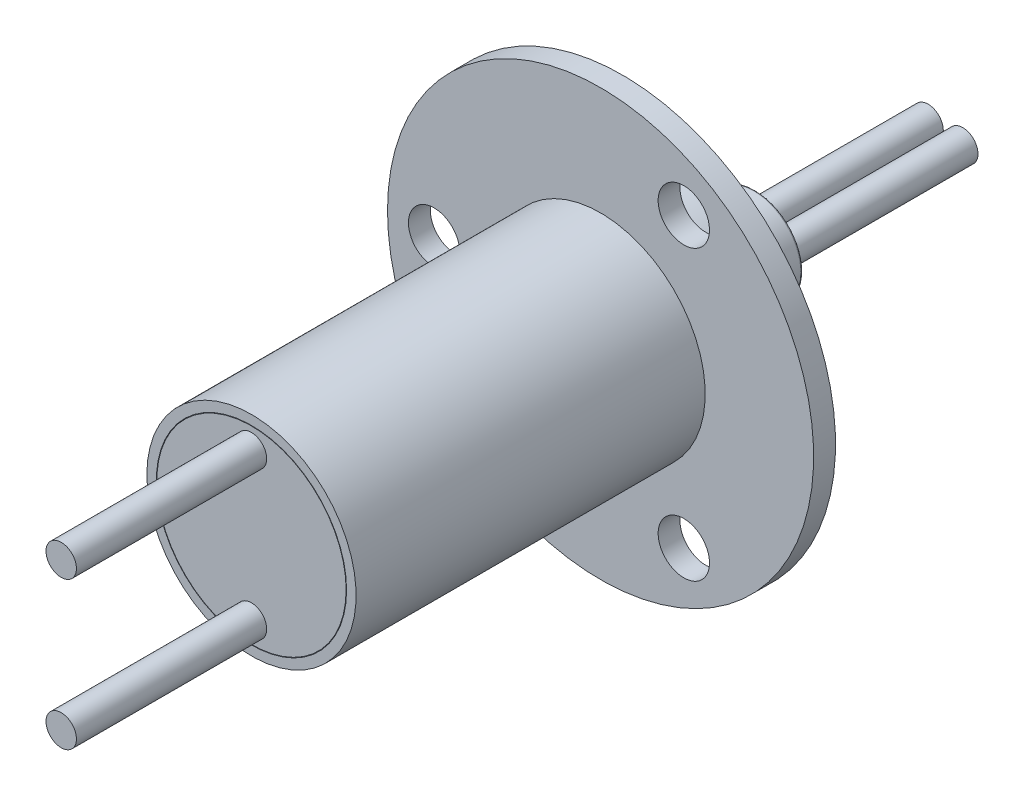
ISO-10303-21;
HEADER;
FILE_DESCRIPTION(('STEP AP214'),'2;1');
FILE_NAME('part.step','',(''),(''),'','','');
FILE_SCHEMA(('AUTOMOTIVE_DESIGN { 1 0 10303 214 1 1 1 1 }'));
ENDSEC;
DATA;
#1=APPLICATION_CONTEXT('core data for automotive mechanical design processes');
#2=APPLICATION_PROTOCOL_DEFINITION('international standard','automotive_design',2000,#1);
#3=PRODUCT_CONTEXT('',#1,'mechanical');
#4=PRODUCT('Part','Part','',(#3));
#5=PRODUCT_RELATED_PRODUCT_CATEGORY('part','',(#4));
#6=PRODUCT_DEFINITION_FORMATION('','',#4);
#7=PRODUCT_DEFINITION_CONTEXT('part definition',#1,'design');
#8=PRODUCT_DEFINITION('design','',#6,#7);
#9=PRODUCT_DEFINITION_SHAPE('','',#8);
#10=(LENGTH_UNIT() NAMED_UNIT(*) SI_UNIT(.MILLI.,.METRE.));
#11=(NAMED_UNIT(*) PLANE_ANGLE_UNIT() SI_UNIT($,.RADIAN.));
#12=(NAMED_UNIT(*) SI_UNIT($,.STERADIAN.) SOLID_ANGLE_UNIT());
#13=UNCERTAINTY_MEASURE_WITH_UNIT(LENGTH_MEASURE(1.E-05),#10,'distance_accuracy_value','');
#14=(GEOMETRIC_REPRESENTATION_CONTEXT(3) GLOBAL_UNCERTAINTY_ASSIGNED_CONTEXT((#13)) GLOBAL_UNIT_ASSIGNED_CONTEXT((#10,
#11,#12)) REPRESENTATION_CONTEXT('',''));
#15=CARTESIAN_POINT('',(0.,0.,0.));
#16=DIRECTION('',(0.,0.,1.));
#17=DIRECTION('',(1.,0.,0.));
#18=AXIS2_PLACEMENT_3D('',#15,#16,#17);
#19=CARTESIAN_POINT('',(-1.77252855070767,0.311486061157739,-19.9));
#20=DIRECTION('',(0.,0.,-1.));
#21=DIRECTION('',(-1.,0.,0.));
#22=AXIS2_PLACEMENT_3D('',#19,#20,#21);
#23=PLANE('',#22);
#24=CARTESIAN_POINT('',(-1.77252855070767,0.311486061157739,-19.9));
#25=DIRECTION('',(0.,0.,1.));
#26=DIRECTION('',(1.,0.,0.));
#27=AXIS2_PLACEMENT_3D('',#24,#25,#26);
#28=CIRCLE('',#27,1.6);
#29=CARTESIAN_POINT('',(-0.172528550707669,0.311486061157739,-19.9));
#30=VERTEX_POINT('',#29);
#31=EDGE_CURVE('E19',#30,#30,#28,.T.);
#32=ORIENTED_EDGE('',*,*,#31,.F.);
#33=EDGE_LOOP('',(#32));
#34=FACE_BOUND('',#33,.T.);
#35=ADVANCED_FACE('F15',(#34),#23,.T.);
#36=CARTESIAN_POINT('',(1.87664787206682,0.,-19.9));
#37=DIRECTION('',(0.,0.,-1.));
#38=DIRECTION('',(-1.,0.,0.));
#39=AXIS2_PLACEMENT_3D('',#36,#37,#38);
#40=PLANE('',#39);
#41=CARTESIAN_POINT('',(1.87664787206682,0.,-19.9));
#42=DIRECTION('',(0.,0.,1.));
#43=DIRECTION('',(1.,0.,0.));
#44=AXIS2_PLACEMENT_3D('',#41,#42,#43);
#45=CIRCLE('',#44,1.6);
#46=CARTESIAN_POINT('',(3.47664787206682,0.,-19.9));
#47=VERTEX_POINT('',#46);
#48=EDGE_CURVE('E109',#47,#47,#45,.T.);
#49=ORIENTED_EDGE('',*,*,#48,.F.);
#50=EDGE_LOOP('',(#49));
#51=FACE_BOUND('',#50,.T.);
#52=ADVANCED_FACE('F120',(#51),#40,.T.);
#53=CARTESIAN_POINT('',(-1.77252855070767,0.311486061157739,-19.9));
#54=DIRECTION('',(0.,0.,1.));
#55=DIRECTION('',(1.,0.,0.));
#56=AXIS2_PLACEMENT_3D('',#53,#54,#55);
#57=CYLINDRICAL_SURFACE('',#56,1.6);
#58=ORIENTED_EDGE('',*,*,#31,.T.);
#59=EDGE_LOOP('',(#58));
#60=FACE_BOUND('',#59,.T.);
#61=CARTESIAN_POINT('',(-1.77252855070767,0.311486061157739,0.0999999999999994));
#62=DIRECTION('',(0.,0.,1.));
#63=DIRECTION('',(1.,0.,0.));
#64=AXIS2_PLACEMENT_3D('',#61,#62,#63);
#65=CIRCLE('',#64,1.6);
#66=CARTESIAN_POINT('',(-0.172528550707669,0.311486061157739,0.0999999999999994));
#67=VERTEX_POINT('',#66);
#68=EDGE_CURVE('E107',#67,#67,#65,.T.);
#69=ORIENTED_EDGE('',*,*,#68,.F.);
#70=EDGE_LOOP('',(#69));
#71=FACE_BOUND('',#70,.T.);
#72=ADVANCED_FACE('F116',(#60,#71),#57,.T.);
#73=CARTESIAN_POINT('',(1.87664787206682,0.,-19.9));
#74=DIRECTION('',(0.,0.,1.));
#75=DIRECTION('',(1.,0.,0.));
#76=AXIS2_PLACEMENT_3D('',#73,#74,#75);
#77=CYLINDRICAL_SURFACE('',#76,1.6);
#78=ORIENTED_EDGE('',*,*,#48,.T.);
#79=EDGE_LOOP('',(#78));
#80=FACE_BOUND('',#79,.T.);
#81=CARTESIAN_POINT('',(1.87664787206682,0.,0.0999999999999994));
#82=DIRECTION('',(0.,0.,1.));
#83=DIRECTION('',(1.,0.,0.));
#84=AXIS2_PLACEMENT_3D('',#81,#82,#83);
#85=CIRCLE('',#84,1.6);
#86=CARTESIAN_POINT('',(3.47664787206682,0.,0.0999999999999994));
#87=VERTEX_POINT('',#86);
#88=EDGE_CURVE('E104',#87,#87,#85,.T.);
#89=ORIENTED_EDGE('',*,*,#88,.F.);
#90=EDGE_LOOP('',(#89));
#91=FACE_BOUND('',#90,.T.);
#92=ADVANCED_FACE('F225',(#80,#91),#77,.T.);
#93=CARTESIAN_POINT('',(0.,0.,0.1));
#94=DIRECTION('',(0.,0.,-1.));
#95=DIRECTION('',(-1.,0.,0.));
#96=AXIS2_PLACEMENT_3D('',#93,#94,#95);
#97=PLANE('',#96);
#98=ORIENTED_EDGE('',*,*,#88,.T.);
#99=EDGE_LOOP('',(#98));
#100=FACE_BOUND('',#99,.T.);
#101=CARTESIAN_POINT('',(0.,0.,0.1));
#102=DIRECTION('',(0.,0.,-1.));
#103=DIRECTION('',(-1.,0.,0.));
#104=AXIS2_PLACEMENT_3D('',#101,#102,#103);
#105=CIRCLE('',#104,3.75);
#106=CARTESIAN_POINT('',(-3.75,0.,0.1));
#107=VERTEX_POINT('',#106);
#108=EDGE_CURVE('E101',#107,#107,#105,.T.);
#109=ORIENTED_EDGE('',*,*,#108,.T.);
#110=EDGE_LOOP('',(#109));
#111=FACE_BOUND('',#110,.T.);
#112=ORIENTED_EDGE('',*,*,#68,.T.);
#113=EDGE_LOOP('',(#112));
#114=FACE_BOUND('',#113,.T.);
#115=ADVANCED_FACE('F221',(#100,#111,#114),#97,.T.);
#116=CARTESIAN_POINT('',(0.,0.,0.1));
#117=DIRECTION('',(0.,0.,-1.));
#118=DIRECTION('',(-1.,0.,0.));
#119=AXIS2_PLACEMENT_3D('',#116,#117,#118);
#120=CYLINDRICAL_SURFACE('',#119,3.75);
#121=ORIENTED_EDGE('',*,*,#108,.F.);
#122=EDGE_LOOP('',(#121));
#123=FACE_BOUND('',#122,.T.);
#124=CARTESIAN_POINT('',(0.,0.,0.));
#125=DIRECTION('',(0.,0.,-1.));
#126=DIRECTION('',(-1.,0.,0.));
#127=AXIS2_PLACEMENT_3D('',#124,#125,#126);
#128=CIRCLE('',#127,3.75);
#129=CARTESIAN_POINT('',(-3.75,0.,0.));
#130=VERTEX_POINT('',#129);
#131=EDGE_CURVE('E98',#130,#130,#128,.T.);
#132=ORIENTED_EDGE('',*,*,#131,.T.);
#133=EDGE_LOOP('',(#132));
#134=FACE_BOUND('',#133,.T.);
#135=ADVANCED_FACE('F217',(#123,#134),#120,.F.);
#136=CARTESIAN_POINT('',(0.,0.,0.));
#137=DIRECTION('',(0.,0.,1.));
#138=DIRECTION('',(1.,0.,0.));
#139=AXIS2_PLACEMENT_3D('',#136,#137,#138);
#140=PLANE('',#139);
#141=CARTESIAN_POINT('',(0.,0.,0.));
#142=DIRECTION('',(0.,0.,1.));
#143=DIRECTION('',(1.,0.,0.));
#144=AXIS2_PLACEMENT_3D('',#141,#142,#143);
#145=CIRCLE('',#144,4.75);
#146=CARTESIAN_POINT('',(4.75,0.,0.));
#147=VERTEX_POINT('',#146);
#148=EDGE_CURVE('E95',#147,#147,#145,.T.);
#149=ORIENTED_EDGE('',*,*,#148,.F.);
#150=EDGE_LOOP('',(#149));
#151=FACE_BOUND('',#150,.T.);
#152=ORIENTED_EDGE('',*,*,#131,.F.);
#153=EDGE_LOOP('',(#152));
#154=FACE_BOUND('',#153,.T.);
#155=ADVANCED_FACE('F214',(#151,#154),#140,.F.);
#156=CARTESIAN_POINT('',(0.,0.,0.199999999999998));
#157=DIRECTION('',(0.,0.,1.));
#158=DIRECTION('',(1.,0.,0.));
#159=AXIS2_PLACEMENT_3D('',#156,#157,#158);
#160=TOROIDAL_SURFACE('',#159,4.75,0.199999999999999);
#161=CARTESIAN_POINT('',(0.,0.,0.2));
#162=DIRECTION('',(0.,0.,-1.));
#163=DIRECTION('',(-1.,0.,0.));
#164=AXIS2_PLACEMENT_3D('',#161,#162,#163);
#165=CIRCLE('',#164,4.95);
#166=CARTESIAN_POINT('',(-4.95,0.,0.2));
#167=VERTEX_POINT('',#166);
#168=EDGE_CURVE('E31',#167,#167,#165,.F.);
#169=ORIENTED_EDGE('',*,*,#168,.F.);
#170=EDGE_LOOP('',(#169));
#171=FACE_BOUND('',#170,.T.);
#172=ORIENTED_EDGE('',*,*,#148,.T.);
#173=EDGE_LOOP('',(#172));
#174=FACE_BOUND('',#173,.T.);
#175=ADVANCED_FACE('F17',(#171,#174),#160,.T.);
#176=CARTESIAN_POINT('',(0.,0.,8.));
#177=DIRECTION('',(0.,0.,-1.));
#178=DIRECTION('',(-1.,0.,0.));
#179=AXIS2_PLACEMENT_3D('',#176,#177,#178);
#180=CYLINDRICAL_SURFACE('',#179,4.95);
#181=ORIENTED_EDGE('',*,*,#168,.T.);
#182=EDGE_LOOP('',(#181));
#183=FACE_BOUND('',#182,.T.);
#184=CARTESIAN_POINT('',(0.,0.,10.));
#185=DIRECTION('',(0.,0.,-1.));
#186=DIRECTION('',(-1.,0.,0.));
#187=AXIS2_PLACEMENT_3D('',#184,#185,#186);
#188=CIRCLE('',#187,4.95);
#189=CARTESIAN_POINT('',(-4.95,0.,10.));
#190=VERTEX_POINT('',#189);
#191=EDGE_CURVE('E92',#190,#190,#188,.F.);
#192=ORIENTED_EDGE('',*,*,#191,.F.);
#193=EDGE_LOOP('',(#192));
#194=FACE_BOUND('',#193,.T.);
#195=ADVANCED_FACE('F209',(#183,#194),#180,.T.);
#196=CARTESIAN_POINT('',(0.,-7.7534764745585,73.));
#197=DIRECTION('',(0.,0.,1.));
#198=DIRECTION('',(1.,0.,0.));
#199=AXIS2_PLACEMENT_3D('',#196,#197,#198);
#200=PLANE('',#199);
#201=CARTESIAN_POINT('',(0.,-7.7534764745585,73.));
#202=DIRECTION('',(0.,0.,-1.));
#203=DIRECTION('',(-1.,0.,0.));
#204=AXIS2_PLACEMENT_3D('',#201,#202,#203);
#205=CIRCLE('',#204,1.6);
#206=CARTESIAN_POINT('',(-1.6,-7.7534764745585,73.));
#207=VERTEX_POINT('',#206);
#208=EDGE_CURVE('E89',#207,#207,#205,.T.);
#209=ORIENTED_EDGE('',*,*,#208,.F.);
#210=EDGE_LOOP('',(#209));
#211=FACE_BOUND('',#210,.T.);
#212=ADVANCED_FACE('F205',(#211),#200,.T.);
#213=CARTESIAN_POINT('',(0.,7.7534764745585,73.));
#214=DIRECTION('',(0.,0.,1.));
#215=DIRECTION('',(1.,0.,0.));
#216=AXIS2_PLACEMENT_3D('',#213,#214,#215);
#217=PLANE('',#216);
#218=CARTESIAN_POINT('',(0.,7.7534764745585,73.));
#219=DIRECTION('',(0.,0.,-1.));
#220=DIRECTION('',(-1.,0.,0.));
#221=AXIS2_PLACEMENT_3D('',#218,#219,#220);
#222=CIRCLE('',#221,1.6);
#223=CARTESIAN_POINT('',(-1.6,7.7534764745585,73.));
#224=VERTEX_POINT('',#223);
#225=EDGE_CURVE('E86',#224,#224,#222,.T.);
#226=ORIENTED_EDGE('',*,*,#225,.F.);
#227=EDGE_LOOP('',(#226));
#228=FACE_BOUND('',#227,.T.);
#229=ADVANCED_FACE('F201',(#228),#217,.T.);
#230=CARTESIAN_POINT('',(0.,0.,10.));
#231=DIRECTION('',(0.,0.,-1.));
#232=DIRECTION('',(-1.,0.,0.));
#233=AXIS2_PLACEMENT_3D('',#230,#231,#232);
#234=PLANE('',#233);
#235=ORIENTED_EDGE('',*,*,#191,.T.);
#236=EDGE_LOOP('',(#235));
#237=FACE_BOUND('',#236,.T.);
#238=CARTESIAN_POINT('',(0.,0.,10.));
#239=DIRECTION('',(0.,0.,-1.));
#240=DIRECTION('',(-1.,0.,0.));
#241=AXIS2_PLACEMENT_3D('',#238,#239,#240);
#242=CIRCLE('',#241,5.05);
#243=CARTESIAN_POINT('',(-5.05,0.,10.));
#244=VERTEX_POINT('',#243);
#245=EDGE_CURVE('E83',#244,#244,#242,.T.);
#246=ORIENTED_EDGE('',*,*,#245,.T.);
#247=EDGE_LOOP('',(#246));
#248=FACE_BOUND('',#247,.T.);
#249=ADVANCED_FACE('F197',(#237,#248),#234,.T.);
#250=CARTESIAN_POINT('',(0.,-7.7534764745585,73.));
#251=DIRECTION('',(0.,0.,-1.));
#252=DIRECTION('',(-1.,0.,0.));
#253=AXIS2_PLACEMENT_3D('',#250,#251,#252);
#254=CYLINDRICAL_SURFACE('',#253,1.6);
#255=ORIENTED_EDGE('',*,*,#208,.T.);
#256=EDGE_LOOP('',(#255));
#257=FACE_BOUND('',#256,.T.);
#258=CARTESIAN_POINT('',(0.,-7.7534764745585,53.));
#259=DIRECTION('',(0.,0.,-1.));
#260=DIRECTION('',(-1.,0.,0.));
#261=AXIS2_PLACEMENT_3D('',#258,#259,#260);
#262=CIRCLE('',#261,1.6);
#263=CARTESIAN_POINT('',(-1.6,-7.7534764745585,53.));
#264=VERTEX_POINT('',#263);
#265=EDGE_CURVE('E80',#264,#264,#262,.T.);
#266=ORIENTED_EDGE('',*,*,#265,.F.);
#267=EDGE_LOOP('',(#266));
#268=FACE_BOUND('',#267,.T.);
#269=ADVANCED_FACE('F193',(#257,#268),#254,.T.);
#270=CARTESIAN_POINT('',(0.,7.7534764745585,73.));
#271=DIRECTION('',(0.,0.,-1.));
#272=DIRECTION('',(-1.,0.,0.));
#273=AXIS2_PLACEMENT_3D('',#270,#271,#272);
#274=CYLINDRICAL_SURFACE('',#273,1.6);
#275=ORIENTED_EDGE('',*,*,#225,.T.);
#276=EDGE_LOOP('',(#275));
#277=FACE_BOUND('',#276,.T.);
#278=CARTESIAN_POINT('',(0.,7.7534764745585,53.));
#279=DIRECTION('',(0.,0.,-1.));
#280=DIRECTION('',(-1.,0.,0.));
#281=AXIS2_PLACEMENT_3D('',#278,#279,#280);
#282=CIRCLE('',#281,1.6);
#283=CARTESIAN_POINT('',(-1.6,7.7534764745585,53.));
#284=VERTEX_POINT('',#283);
#285=EDGE_CURVE('E77',#284,#284,#282,.T.);
#286=ORIENTED_EDGE('',*,*,#285,.F.);
#287=EDGE_LOOP('',(#286));
#288=FACE_BOUND('',#287,.T.);
#289=ADVANCED_FACE('F189',(#277,#288),#274,.T.);
#290=CARTESIAN_POINT('',(0.,0.,10.));
#291=DIRECTION('',(0.,0.,-1.));
#292=DIRECTION('',(-1.,0.,0.));
#293=AXIS2_PLACEMENT_3D('',#290,#291,#292);
#294=CYLINDRICAL_SURFACE('',#293,5.05);
#295=ORIENTED_EDGE('',*,*,#245,.F.);
#296=EDGE_LOOP('',(#295));
#297=FACE_BOUND('',#296,.T.);
#298=CARTESIAN_POINT('',(0.,0.,8.));
#299=DIRECTION('',(0.,0.,-1.));
#300=DIRECTION('',(-1.,0.,0.));
#301=AXIS2_PLACEMENT_3D('',#298,#299,#300);
#302=CIRCLE('',#301,5.05);
#303=CARTESIAN_POINT('',(-5.05,0.,8.));
#304=VERTEX_POINT('',#303);
#305=EDGE_CURVE('E74',#304,#304,#302,.T.);
#306=ORIENTED_EDGE('',*,*,#305,.T.);
#307=EDGE_LOOP('',(#306));
#308=FACE_BOUND('',#307,.T.);
#309=ADVANCED_FACE('F185',(#297,#308),#294,.F.);
#310=CARTESIAN_POINT('',(0.,0.,53.));
#311=DIRECTION('',(0.,0.,1.));
#312=DIRECTION('',(1.,0.,0.));
#313=AXIS2_PLACEMENT_3D('',#310,#311,#312);
#314=PLANE('',#313);
#315=ORIENTED_EDGE('',*,*,#285,.T.);
#316=EDGE_LOOP('',(#315));
#317=FACE_BOUND('',#316,.T.);
#318=CARTESIAN_POINT('',(0.,0.,53.));
#319=DIRECTION('',(0.,0.,1.));
#320=DIRECTION('',(1.,0.,0.));
#321=AXIS2_PLACEMENT_3D('',#318,#319,#320);
#322=CIRCLE('',#321,9.95);
#323=CARTESIAN_POINT('',(9.95,0.,53.));
#324=VERTEX_POINT('',#323);
#325=EDGE_CURVE('E71',#324,#324,#322,.F.);
#326=ORIENTED_EDGE('',*,*,#325,.F.);
#327=EDGE_LOOP('',(#326));
#328=FACE_BOUND('',#327,.T.);
#329=ORIENTED_EDGE('',*,*,#265,.T.);
#330=EDGE_LOOP('',(#329));
#331=FACE_BOUND('',#330,.T.);
#332=ADVANCED_FACE('F181',(#317,#328,#331),#314,.T.);
#333=CARTESIAN_POINT('',(0.,0.,8.));
#334=DIRECTION('',(0.,0.,1.));
#335=DIRECTION('',(1.,0.,0.));
#336=AXIS2_PLACEMENT_3D('',#333,#334,#335);
#337=PLANE('',#336);
#338=ORIENTED_EDGE('',*,*,#305,.F.);
#339=EDGE_LOOP('',(#338));
#340=FACE_BOUND('',#339,.T.);
#341=CARTESIAN_POINT('',(0.,0.,8.));
#342=DIRECTION('',(0.,0.,-1.));
#343=DIRECTION('',(-1.,0.,0.));
#344=AXIS2_PLACEMENT_3D('',#341,#342,#343);
#345=CIRCLE('',#344,11.);
#346=CARTESIAN_POINT('',(-11.,0.,8.));
#347=VERTEX_POINT('',#346);
#348=EDGE_CURVE('E68',#347,#347,#345,.F.);
#349=ORIENTED_EDGE('',*,*,#348,.F.);
#350=EDGE_LOOP('',(#349));
#351=FACE_BOUND('',#350,.T.);
#352=ADVANCED_FACE('F177',(#340,#351),#337,.F.);
#353=CARTESIAN_POINT('',(0.,0.,52.));
#354=DIRECTION('',(0.,0.,1.));
#355=DIRECTION('',(1.,0.,0.));
#356=AXIS2_PLACEMENT_3D('',#353,#354,#355);
#357=CYLINDRICAL_SURFACE('',#356,9.95);
#358=ORIENTED_EDGE('',*,*,#325,.T.);
#359=EDGE_LOOP('',(#358));
#360=FACE_BOUND('',#359,.T.);
#361=CARTESIAN_POINT('',(0.,0.,52.));
#362=DIRECTION('',(0.,0.,1.));
#363=DIRECTION('',(1.,0.,0.));
#364=AXIS2_PLACEMENT_3D('',#361,#362,#363);
#365=CIRCLE('',#364,9.95);
#366=CARTESIAN_POINT('',(9.95,0.,52.));
#367=VERTEX_POINT('',#366);
#368=EDGE_CURVE('E65',#367,#367,#365,.F.);
#369=ORIENTED_EDGE('',*,*,#368,.F.);
#370=EDGE_LOOP('',(#369));
#371=FACE_BOUND('',#370,.T.);
#372=ADVANCED_FACE('F173',(#360,#371),#357,.T.);
#373=CARTESIAN_POINT('',(0.,0.,53.));
#374=DIRECTION('',(0.,0.,-1.));
#375=DIRECTION('',(-1.,0.,0.));
#376=AXIS2_PLACEMENT_3D('',#373,#374,#375);
#377=CYLINDRICAL_SURFACE('',#376,11.);
#378=ORIENTED_EDGE('',*,*,#348,.T.);
#379=EDGE_LOOP('',(#378));
#380=FACE_BOUND('',#379,.T.);
#381=CARTESIAN_POINT('',(0.,0.,14.));
#382=DIRECTION('',(0.,0.,-1.));
#383=DIRECTION('',(-1.,0.,0.));
#384=AXIS2_PLACEMENT_3D('',#381,#382,#383);
#385=CIRCLE('',#384,11.);
#386=CARTESIAN_POINT('',(-11.,0.,14.));
#387=VERTEX_POINT('',#386);
#388=EDGE_CURVE('E62',#387,#387,#385,.F.);
#389=ORIENTED_EDGE('',*,*,#388,.F.);
#390=EDGE_LOOP('',(#389));
#391=FACE_BOUND('',#390,.T.);
#392=ADVANCED_FACE('F169',(#380,#391),#377,.T.);
#393=CARTESIAN_POINT('',(0.,0.,52.));
#394=DIRECTION('',(0.,0.,1.));
#395=DIRECTION('',(1.,0.,0.));
#396=AXIS2_PLACEMENT_3D('',#393,#394,#395);
#397=PLANE('',#396);
#398=ORIENTED_EDGE('',*,*,#368,.T.);
#399=EDGE_LOOP('',(#398));
#400=FACE_BOUND('',#399,.T.);
#401=CARTESIAN_POINT('',(0.,0.,52.));
#402=DIRECTION('',(0.,0.,1.));
#403=DIRECTION('',(1.,0.,0.));
#404=AXIS2_PLACEMENT_3D('',#401,#402,#403);
#405=CIRCLE('',#404,10.);
#406=CARTESIAN_POINT('',(10.,0.,52.));
#407=VERTEX_POINT('',#406);
#408=EDGE_CURVE('E59',#407,#407,#405,.T.);
#409=ORIENTED_EDGE('',*,*,#408,.T.);
#410=EDGE_LOOP('',(#409));
#411=FACE_BOUND('',#410,.T.);
#412=ADVANCED_FACE('F165',(#400,#411),#397,.T.);
#413=CARTESIAN_POINT('',(0.,0.,14.));
#414=DIRECTION('',(0.,0.,-1.));
#415=DIRECTION('',(-1.,0.,0.));
#416=AXIS2_PLACEMENT_3D('',#413,#414,#415);
#417=PLANE('',#416);
#418=CARTESIAN_POINT('',(8.74999999999986,15.1554445662278,14.));
#419=DIRECTION('',(0.,0.,-1.));
#420=DIRECTION('',(-1.,0.,0.));
#421=AXIS2_PLACEMENT_3D('',#418,#419,#420);
#422=CIRCLE('',#421,2.7);
#423=CARTESIAN_POINT('',(6.04999999999986,15.1554445662278,14.));
#424=VERTEX_POINT('',#423);
#425=EDGE_CURVE('E47',#424,#424,#422,.F.);
#426=ORIENTED_EDGE('',*,*,#425,.T.);
#427=EDGE_LOOP('',(#426));
#428=FACE_BOUND('',#427,.T.);
#429=CARTESIAN_POINT('',(8.75000000000007,-15.1554445662276,14.));
#430=DIRECTION('',(0.,0.,-1.));
#431=DIRECTION('',(-1.,0.,0.));
#432=AXIS2_PLACEMENT_3D('',#429,#430,#431);
#433=CIRCLE('',#432,2.7);
#434=CARTESIAN_POINT('',(6.05000000000007,-15.1554445662276,14.));
#435=VERTEX_POINT('',#434);
#436=EDGE_CURVE('E50',#435,#435,#433,.F.);
#437=ORIENTED_EDGE('',*,*,#436,.T.);
#438=EDGE_LOOP('',(#437));
#439=FACE_BOUND('',#438,.T.);
#440=CARTESIAN_POINT('',(-17.5,0.,14.));
#441=DIRECTION('',(0.,0.,-1.));
#442=DIRECTION('',(-1.,0.,0.));
#443=AXIS2_PLACEMENT_3D('',#440,#441,#442);
#444=CIRCLE('',#443,2.7);
#445=CARTESIAN_POINT('',(-20.2,0.,14.));
#446=VERTEX_POINT('',#445);
#447=EDGE_CURVE('E53',#446,#446,#444,.F.);
#448=ORIENTED_EDGE('',*,*,#447,.T.);
#449=EDGE_LOOP('',(#448));
#450=FACE_BOUND('',#449,.T.);
#451=ORIENTED_EDGE('',*,*,#388,.T.);
#452=EDGE_LOOP('',(#451));
#453=FACE_BOUND('',#452,.T.);
#454=CARTESIAN_POINT('',(0.,0.,14.));
#455=DIRECTION('',(0.,0.,-1.));
#456=DIRECTION('',(-1.,0.,0.));
#457=AXIS2_PLACEMENT_3D('',#454,#455,#456);
#458=CIRCLE('',#457,22.4);
#459=CARTESIAN_POINT('',(-22.4,0.,14.));
#460=VERTEX_POINT('',#459);
#461=EDGE_CURVE('E56',#460,#460,#458,.F.);
#462=ORIENTED_EDGE('',*,*,#461,.F.);
#463=EDGE_LOOP('',(#462));
#464=FACE_BOUND('',#463,.T.);
#465=ADVANCED_FACE('F161',(#428,#439,#450,#453,#464),#417,.T.);
#466=CARTESIAN_POINT('',(0.,0.,52.));
#467=DIRECTION('',(0.,0.,1.));
#468=DIRECTION('',(1.,0.,0.));
#469=AXIS2_PLACEMENT_3D('',#466,#467,#468);
#470=CYLINDRICAL_SURFACE('',#469,10.);
#471=ORIENTED_EDGE('',*,*,#408,.F.);
#472=EDGE_LOOP('',(#471));
#473=FACE_BOUND('',#472,.T.);
#474=CARTESIAN_POINT('',(0.,0.,53.));
#475=DIRECTION('',(0.,0.,1.));
#476=DIRECTION('',(1.,0.,0.));
#477=AXIS2_PLACEMENT_3D('',#474,#475,#476);
#478=CIRCLE('',#477,10.);
#479=CARTESIAN_POINT('',(10.,0.,53.));
#480=VERTEX_POINT('',#479);
#481=EDGE_CURVE('E44',#480,#480,#478,.F.);
#482=ORIENTED_EDGE('',*,*,#481,.F.);
#483=EDGE_LOOP('',(#482));
#484=FACE_BOUND('',#483,.T.);
#485=ADVANCED_FACE('F157',(#473,#484),#470,.F.);
#486=CARTESIAN_POINT('',(0.,0.,16.3));
#487=DIRECTION('',(0.,0.,-1.));
#488=DIRECTION('',(-1.,0.,0.));
#489=AXIS2_PLACEMENT_3D('',#486,#487,#488);
#490=CYLINDRICAL_SURFACE('',#489,22.4);
#491=ORIENTED_EDGE('',*,*,#461,.T.);
#492=EDGE_LOOP('',(#491));
#493=FACE_BOUND('',#492,.T.);
#494=CARTESIAN_POINT('',(0.,0.,16.3));
#495=DIRECTION('',(0.,0.,-1.));
#496=DIRECTION('',(-1.,0.,0.));
#497=AXIS2_PLACEMENT_3D('',#494,#495,#496);
#498=CIRCLE('',#497,22.4);
#499=CARTESIAN_POINT('',(-22.4,0.,16.3));
#500=VERTEX_POINT('',#499);
#501=EDGE_CURVE('E41',#500,#500,#498,.T.);
#502=ORIENTED_EDGE('',*,*,#501,.T.);
#503=EDGE_LOOP('',(#502));
#504=FACE_BOUND('',#503,.T.);
#505=ADVANCED_FACE('F153',(#493,#504),#490,.T.);
#506=CARTESIAN_POINT('',(-17.5,0.,53.001));
#507=DIRECTION('',(0.,0.,-1.));
#508=DIRECTION('',(-1.,0.,0.));
#509=AXIS2_PLACEMENT_3D('',#506,#507,#508);
#510=CYLINDRICAL_SURFACE('',#509,2.7);
#511=ORIENTED_EDGE('',*,*,#447,.F.);
#512=EDGE_LOOP('',(#511));
#513=FACE_BOUND('',#512,.T.);
#514=CARTESIAN_POINT('',(-17.5,0.,16.3));
#515=DIRECTION('',(0.,0.,-1.));
#516=DIRECTION('',(-1.,0.,0.));
#517=AXIS2_PLACEMENT_3D('',#514,#515,#516);
#518=CIRCLE('',#517,2.7);
#519=CARTESIAN_POINT('',(-20.2,0.,16.3));
#520=VERTEX_POINT('',#519);
#521=EDGE_CURVE('E38',#520,#520,#518,.F.);
#522=ORIENTED_EDGE('',*,*,#521,.T.);
#523=EDGE_LOOP('',(#522));
#524=FACE_BOUND('',#523,.T.);
#525=ADVANCED_FACE('F149',(#513,#524),#510,.F.);
#526=CARTESIAN_POINT('',(8.75000000000007,-15.1554445662276,53.001));
#527=DIRECTION('',(0.,0.,-1.));
#528=DIRECTION('',(-1.,0.,0.));
#529=AXIS2_PLACEMENT_3D('',#526,#527,#528);
#530=CYLINDRICAL_SURFACE('',#529,2.7);
#531=ORIENTED_EDGE('',*,*,#436,.F.);
#532=EDGE_LOOP('',(#531));
#533=FACE_BOUND('',#532,.T.);
#534=CARTESIAN_POINT('',(8.75000000000007,-15.1554445662276,16.3));
#535=DIRECTION('',(0.,0.,-1.));
#536=DIRECTION('',(-1.,0.,0.));
#537=AXIS2_PLACEMENT_3D('',#534,#535,#536);
#538=CIRCLE('',#537,2.7);
#539=CARTESIAN_POINT('',(6.05000000000007,-15.1554445662276,16.3));
#540=VERTEX_POINT('',#539);
#541=EDGE_CURVE('E35',#540,#540,#538,.F.);
#542=ORIENTED_EDGE('',*,*,#541,.T.);
#543=EDGE_LOOP('',(#542));
#544=FACE_BOUND('',#543,.T.);
#545=ADVANCED_FACE('F145',(#533,#544),#530,.F.);
#546=CARTESIAN_POINT('',(8.74999999999986,15.1554445662278,53.001));
#547=DIRECTION('',(0.,0.,-1.));
#548=DIRECTION('',(-1.,0.,0.));
#549=AXIS2_PLACEMENT_3D('',#546,#547,#548);
#550=CYLINDRICAL_SURFACE('',#549,2.7);
#551=ORIENTED_EDGE('',*,*,#425,.F.);
#552=EDGE_LOOP('',(#551));
#553=FACE_BOUND('',#552,.T.);
#554=CARTESIAN_POINT('',(8.74999999999986,15.1554445662278,16.3));
#555=DIRECTION('',(0.,0.,-1.));
#556=DIRECTION('',(-1.,0.,0.));
#557=AXIS2_PLACEMENT_3D('',#554,#555,#556);
#558=CIRCLE('',#557,2.7);
#559=CARTESIAN_POINT('',(6.04999999999986,15.1554445662278,16.3));
#560=VERTEX_POINT('',#559);
#561=EDGE_CURVE('E28',#560,#560,#558,.F.);
#562=ORIENTED_EDGE('',*,*,#561,.T.);
#563=EDGE_LOOP('',(#562));
#564=FACE_BOUND('',#563,.T.);
#565=ADVANCED_FACE('F141',(#553,#564),#550,.F.);
#566=CARTESIAN_POINT('',(0.,0.,53.));
#567=DIRECTION('',(0.,0.,1.));
#568=DIRECTION('',(1.,0.,0.));
#569=AXIS2_PLACEMENT_3D('',#566,#567,#568);
#570=PLANE('',#569);
#571=ORIENTED_EDGE('',*,*,#481,.T.);
#572=EDGE_LOOP('',(#571));
#573=FACE_BOUND('',#572,.T.);
#574=CARTESIAN_POINT('',(0.,0.,53.));
#575=DIRECTION('',(0.,0.,-1.));
#576=DIRECTION('',(-1.,0.,0.));
#577=AXIS2_PLACEMENT_3D('',#574,#575,#576);
#578=CIRCLE('',#577,11.);
#579=CARTESIAN_POINT('',(-11.,0.,53.));
#580=VERTEX_POINT('',#579);
#581=EDGE_CURVE('E23',#580,#580,#578,.T.);
#582=ORIENTED_EDGE('',*,*,#581,.F.);
#583=EDGE_LOOP('',(#582));
#584=FACE_BOUND('',#583,.T.);
#585=ADVANCED_FACE('F134',(#573,#584),#570,.T.);
#586=CARTESIAN_POINT('',(0.,0.,16.3));
#587=DIRECTION('',(0.,0.,-1.));
#588=DIRECTION('',(-1.,0.,0.));
#589=AXIS2_PLACEMENT_3D('',#586,#587,#588);
#590=PLANE('',#589);
#591=ORIENTED_EDGE('',*,*,#561,.F.);
#592=EDGE_LOOP('',(#591));
#593=FACE_BOUND('',#592,.T.);
#594=ORIENTED_EDGE('',*,*,#541,.F.);
#595=EDGE_LOOP('',(#594));
#596=FACE_BOUND('',#595,.T.);
#597=ORIENTED_EDGE('',*,*,#521,.F.);
#598=EDGE_LOOP('',(#597));
#599=FACE_BOUND('',#598,.T.);
#600=CARTESIAN_POINT('',(0.,0.,16.3));
#601=DIRECTION('',(0.,0.,-1.));
#602=DIRECTION('',(-1.,0.,0.));
#603=AXIS2_PLACEMENT_3D('',#600,#601,#602);
#604=CIRCLE('',#603,11.);
#605=CARTESIAN_POINT('',(-11.,0.,16.3));
#606=VERTEX_POINT('',#605);
#607=EDGE_CURVE('E10',#606,#606,#604,.F.);
#608=ORIENTED_EDGE('',*,*,#607,.F.);
#609=EDGE_LOOP('',(#608));
#610=FACE_BOUND('',#609,.T.);
#611=ORIENTED_EDGE('',*,*,#501,.F.);
#612=EDGE_LOOP('',(#611));
#613=FACE_BOUND('',#612,.T.);
#614=ADVANCED_FACE('F129',(#593,#596,#599,#610,#613),#590,.F.);
#615=CARTESIAN_POINT('',(0.,0.,53.));
#616=DIRECTION('',(0.,0.,-1.));
#617=DIRECTION('',(-1.,0.,0.));
#618=AXIS2_PLACEMENT_3D('',#615,#616,#617);
#619=CYLINDRICAL_SURFACE('',#618,11.);
#620=ORIENTED_EDGE('',*,*,#607,.T.);
#621=EDGE_LOOP('',(#620));
#622=FACE_BOUND('',#621,.T.);
#623=ORIENTED_EDGE('',*,*,#581,.T.);
#624=EDGE_LOOP('',(#623));
#625=FACE_BOUND('',#624,.T.);
#626=ADVANCED_FACE('F127',(#622,#625),#619,.T.);
#627=CLOSED_SHELL('',(#35,#52,#72,#92,#115,#135,#155,#175,#195,#212,#229,#249,#269,#289,#309,
#332,#352,#372,#392,#412,#465,#485,#505,#525,#545,#565,#585,#614,#626));
#628=MANIFOLD_SOLID_BREP('B1',#627);
#629=ADVANCED_BREP_SHAPE_REPRESENTATION('',(#18,#628),#14);
#630=SHAPE_DEFINITION_REPRESENTATION(#9,#629);
ENDSEC;
END-ISO-10303-21;
